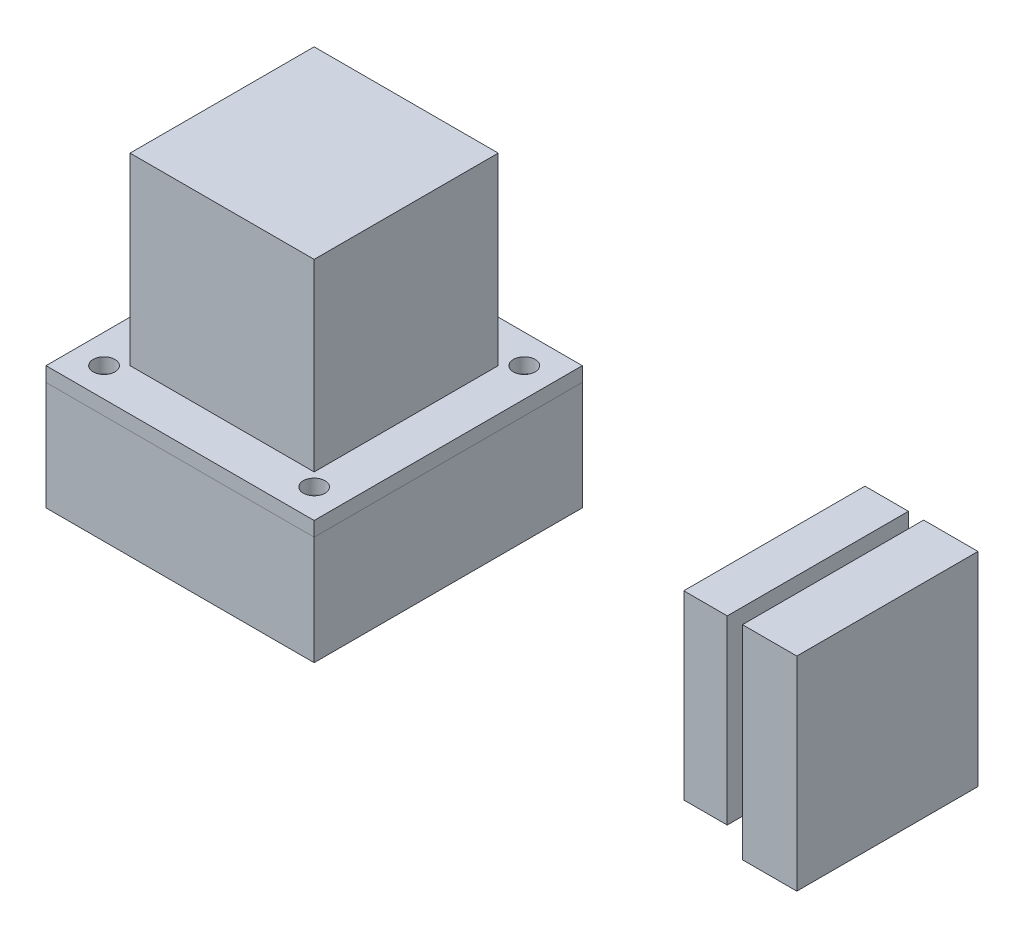
ISO-10303-21;
HEADER;
FILE_DESCRIPTION(('STEP AP214'),'2;1');
FILE_NAME('part.step','',(''),(''),'','','');
FILE_SCHEMA(('AUTOMOTIVE_DESIGN { 1 0 10303 214 1 1 1 1 }'));
ENDSEC;
DATA;
#1=APPLICATION_CONTEXT('core data for automotive mechanical design processes');
#2=APPLICATION_PROTOCOL_DEFINITION('international standard','automotive_design',2000,#1);
#3=PRODUCT_CONTEXT('',#1,'mechanical');
#4=PRODUCT('Part','Part','',(#3));
#5=PRODUCT_RELATED_PRODUCT_CATEGORY('part','',(#4));
#6=PRODUCT_DEFINITION_FORMATION('','',#4);
#7=PRODUCT_DEFINITION_CONTEXT('part definition',#1,'design');
#8=PRODUCT_DEFINITION('design','',#6,#7);
#9=PRODUCT_DEFINITION_SHAPE('','',#8);
#10=(LENGTH_UNIT() NAMED_UNIT(*) SI_UNIT(.MILLI.,.METRE.));
#11=(NAMED_UNIT(*) PLANE_ANGLE_UNIT() SI_UNIT($,.RADIAN.));
#12=(NAMED_UNIT(*) SI_UNIT($,.STERADIAN.) SOLID_ANGLE_UNIT());
#13=UNCERTAINTY_MEASURE_WITH_UNIT(LENGTH_MEASURE(1.E-05),#10,'distance_accuracy_value','');
#14=(GEOMETRIC_REPRESENTATION_CONTEXT(3) GLOBAL_UNCERTAINTY_ASSIGNED_CONTEXT((#13)) GLOBAL_UNIT_ASSIGNED_CONTEXT((#10,
#11,#12)) REPRESENTATION_CONTEXT('',''));
#15=CARTESIAN_POINT('',(0.,0.,0.));
#16=DIRECTION('',(0.,0.,1.));
#17=DIRECTION('',(1.,0.,0.));
#18=AXIS2_PLACEMENT_3D('',#15,#16,#17);
#19=CARTESIAN_POINT('',(-50.8,26.8,12.7));
#20=DIRECTION('',(-1.,0.,0.));
#21=DIRECTION('',(0.,0.,1.));
#22=AXIS2_PLACEMENT_3D('',#19,#20,#21);
#23=PLANE('',#22);
#24=DIRECTION('',(0.,0.,-1.));
#25=VECTOR('',#24,1.);
#26=CARTESIAN_POINT('',(-50.8,1.4,12.7));
#27=LINE('',#26,#25);
#28=CARTESIAN_POINT('',(-50.8,1.4,12.7));
#29=VERTEX_POINT('',#28);
#30=CARTESIAN_POINT('',(-50.8,1.4,-12.7));
#31=VERTEX_POINT('',#30);
#32=EDGE_CURVE('E108',#29,#31,#27,.T.);
#33=ORIENTED_EDGE('',*,*,#32,.T.);
#34=DIRECTION('',(0.,-1.,0.));
#35=VECTOR('',#34,1.);
#36=CARTESIAN_POINT('',(-50.8,26.8,-12.7));
#37=LINE('',#36,#35);
#38=CARTESIAN_POINT('',(-50.8,26.8,-12.7));
#39=VERTEX_POINT('',#38);
#40=EDGE_CURVE('E12',#39,#31,#37,.T.);
#41=ORIENTED_EDGE('',*,*,#40,.F.);
#42=DIRECTION('',(0.,0.,-1.));
#43=VECTOR('',#42,1.);
#44=CARTESIAN_POINT('',(-50.8,26.8,12.7));
#45=LINE('',#44,#43);
#46=CARTESIAN_POINT('',(-50.8,26.8,12.7));
#47=VERTEX_POINT('',#46);
#48=EDGE_CURVE('E96',#47,#39,#45,.T.);
#49=ORIENTED_EDGE('',*,*,#48,.F.);
#50=DIRECTION('',(0.,-1.,0.));
#51=VECTOR('',#50,1.);
#52=CARTESIAN_POINT('',(-50.8,26.8,12.7));
#53=LINE('',#52,#51);
#54=EDGE_CURVE('E104',#47,#29,#53,.T.);
#55=ORIENTED_EDGE('',*,*,#54,.T.);
#56=EDGE_LOOP('',(#33,#41,#49,#55));
#57=FACE_BOUND('',#56,.T.);
#58=ADVANCED_FACE('F45',(#57),#23,.F.);
#59=CARTESIAN_POINT('',(-76.2,26.8,-12.7));
#60=DIRECTION('',(0.,0.,1.));
#61=DIRECTION('',(0.,-1.,0.));
#62=AXIS2_PLACEMENT_3D('',#59,#60,#61);
#63=PLANE('',#62);
#64=DIRECTION('',(-1.,0.,0.));
#65=VECTOR('',#64,1.);
#66=CARTESIAN_POINT('',(-76.2,1.4,-12.7));
#67=LINE('',#66,#65);
#68=CARTESIAN_POINT('',(-76.2,1.4,-12.7));
#69=VERTEX_POINT('',#68);
#70=EDGE_CURVE('E100',#31,#69,#67,.T.);
#71=ORIENTED_EDGE('',*,*,#70,.T.);
#72=DIRECTION('',(0.,-1.,0.));
#73=VECTOR('',#72,1.);
#74=CARTESIAN_POINT('',(-76.2,26.8,-12.7));
#75=LINE('',#74,#73);
#76=CARTESIAN_POINT('',(-76.2,26.8,-12.7));
#77=VERTEX_POINT('',#76);
#78=EDGE_CURVE('E53',#77,#69,#75,.T.);
#79=ORIENTED_EDGE('',*,*,#78,.F.);
#80=DIRECTION('',(-1.,0.,0.));
#81=VECTOR('',#80,1.);
#82=CARTESIAN_POINT('',(-76.2,26.8,-12.7));
#83=LINE('',#82,#81);
#84=EDGE_CURVE('E91',#39,#77,#83,.T.);
#85=ORIENTED_EDGE('',*,*,#84,.F.);
#86=ORIENTED_EDGE('',*,*,#40,.T.);
#87=EDGE_LOOP('',(#71,#79,#85,#86));
#88=FACE_BOUND('',#87,.T.);
#89=ADVANCED_FACE('F99',(#88),#63,.F.);
#90=CARTESIAN_POINT('',(-76.2,26.8,12.7));
#91=DIRECTION('',(1.,0.,0.));
#92=DIRECTION('',(0.,0.,-1.));
#93=AXIS2_PLACEMENT_3D('',#90,#91,#92);
#94=PLANE('',#93);
#95=DIRECTION('',(0.,0.,1.));
#96=VECTOR('',#95,1.);
#97=CARTESIAN_POINT('',(-76.2,1.4,12.7));
#98=LINE('',#97,#96);
#99=CARTESIAN_POINT('',(-76.2,1.4,12.7));
#100=VERTEX_POINT('',#99);
#101=EDGE_CURVE('E78',#69,#100,#98,.T.);
#102=ORIENTED_EDGE('',*,*,#101,.T.);
#103=DIRECTION('',(0.,-1.,0.));
#104=VECTOR('',#103,1.);
#105=CARTESIAN_POINT('',(-76.2,26.8,12.7));
#106=LINE('',#105,#104);
#107=CARTESIAN_POINT('',(-76.2,26.8,12.7));
#108=VERTEX_POINT('',#107);
#109=EDGE_CURVE('E101',#108,#100,#106,.T.);
#110=ORIENTED_EDGE('',*,*,#109,.F.);
#111=DIRECTION('',(0.,0.,1.));
#112=VECTOR('',#111,1.);
#113=CARTESIAN_POINT('',(-76.2,26.8,12.7));
#114=LINE('',#113,#112);
#115=EDGE_CURVE('E94',#77,#108,#114,.T.);
#116=ORIENTED_EDGE('',*,*,#115,.F.);
#117=ORIENTED_EDGE('',*,*,#78,.T.);
#118=EDGE_LOOP('',(#102,#110,#116,#117));
#119=FACE_BOUND('',#118,.T.);
#120=ADVANCED_FACE('F102',(#119),#94,.F.);
#121=CARTESIAN_POINT('',(-76.2,26.8,12.7));
#122=DIRECTION('',(0.,0.,-1.));
#123=DIRECTION('',(0.,1.,0.));
#124=AXIS2_PLACEMENT_3D('',#121,#122,#123);
#125=PLANE('',#124);
#126=DIRECTION('',(1.,0.,0.));
#127=VECTOR('',#126,1.);
#128=CARTESIAN_POINT('',(-76.2,1.4,12.7));
#129=LINE('',#128,#127);
#130=EDGE_CURVE('E84',#100,#29,#129,.T.);
#131=ORIENTED_EDGE('',*,*,#130,.T.);
#132=ORIENTED_EDGE('',*,*,#54,.F.);
#133=DIRECTION('',(1.,0.,0.));
#134=VECTOR('',#133,1.);
#135=CARTESIAN_POINT('',(-76.2,26.8,12.7));
#136=LINE('',#135,#134);
#137=EDGE_CURVE('E61',#108,#47,#136,.T.);
#138=ORIENTED_EDGE('',*,*,#137,.F.);
#139=ORIENTED_EDGE('',*,*,#109,.T.);
#140=EDGE_LOOP('',(#131,#132,#138,#139));
#141=FACE_BOUND('',#140,.T.);
#142=ADVANCED_FACE('F115',(#141),#125,.F.);
#143=CARTESIAN_POINT('',(0.,26.8,0.));
#144=DIRECTION('',(0.,-1.,0.));
#145=DIRECTION('',(0.,0.,-1.));
#146=AXIS2_PLACEMENT_3D('',#143,#144,#145);
#147=PLANE('',#146);
#148=ORIENTED_EDGE('',*,*,#48,.T.);
#149=ORIENTED_EDGE('',*,*,#84,.T.);
#150=ORIENTED_EDGE('',*,*,#115,.T.);
#151=ORIENTED_EDGE('',*,*,#137,.T.);
#152=EDGE_LOOP('',(#148,#149,#150,#151));
#153=FACE_BOUND('',#152,.T.);
#154=ADVANCED_FACE('F92',(#153),#147,.F.);
#155=CARTESIAN_POINT('',(0.,1.4,0.));
#156=DIRECTION('',(0.,-1.,0.));
#157=DIRECTION('',(0.,0.,-1.));
#158=AXIS2_PLACEMENT_3D('',#155,#156,#157);
#159=PLANE('',#158);
#160=ORIENTED_EDGE('',*,*,#32,.F.);
#161=ORIENTED_EDGE('',*,*,#130,.F.);
#162=ORIENTED_EDGE('',*,*,#101,.F.);
#163=ORIENTED_EDGE('',*,*,#70,.F.);
#164=EDGE_LOOP('',(#160,#161,#162,#163));
#165=FACE_BOUND('',#164,.T.);
#166=ADVANCED_FACE('F118',(#165),#159,.T.);
#167=CLOSED_SHELL('',(#58,#89,#120,#142,#154,#166));
#168=MANIFOLD_SOLID_BREP('B2',#167);
#169=CARTESIAN_POINT('',(0.,1.4,0.));
#170=DIRECTION('',(0.,1.,0.));
#171=DIRECTION('',(0.,0.,1.));
#172=AXIS2_PLACEMENT_3D('',#169,#170,#171);
#173=PLANE('',#172);
#174=CARTESIAN_POINT('',(-49.0043109856754,1.4,-14.4956890143243));
#175=DIRECTION('',(0.,1.,0.));
#176=DIRECTION('',(0.,0.,1.));
#177=AXIS2_PLACEMENT_3D('',#174,#175,#176);
#178=CIRCLE('',#177,1.50000000000001);
#179=CARTESIAN_POINT('',(-49.0043109856754,1.4,-12.9956890143243));
#180=VERTEX_POINT('',#179);
#181=EDGE_CURVE('E266',#180,#180,#178,.T.);
#182=ORIENTED_EDGE('',*,*,#181,.F.);
#183=EDGE_LOOP('',(#182));
#184=FACE_BOUND('',#183,.T.);
#185=CARTESIAN_POINT('',(-77.9956890143241,1.4,14.495689014324));
#186=DIRECTION('',(0.,1.,0.));
#187=DIRECTION('',(0.,0.,1.));
#188=AXIS2_PLACEMENT_3D('',#185,#186,#187);
#189=CIRCLE('',#188,1.5);
#190=CARTESIAN_POINT('',(-77.9956890143241,1.4,15.995689014324));
#191=VERTEX_POINT('',#190);
#192=EDGE_CURVE('E245',#191,#191,#189,.T.);
#193=ORIENTED_EDGE('',*,*,#192,.F.);
#194=EDGE_LOOP('',(#193));
#195=FACE_BOUND('',#194,.T.);
#196=DIRECTION('',(0.,0.,1.));
#197=VECTOR('',#196,1.);
#198=CARTESIAN_POINT('',(-82.,1.4,-18.5));
#199=LINE('',#198,#197);
#200=CARTESIAN_POINT('',(-82.,1.4,-18.5));
#201=VERTEX_POINT('',#200);
#202=CARTESIAN_POINT('',(-82.,1.4,18.5));
#203=VERTEX_POINT('',#202);
#204=EDGE_CURVE('E230',#201,#203,#199,.T.);
#205=ORIENTED_EDGE('',*,*,#204,.T.);
#206=DIRECTION('',(1.,0.,0.));
#207=VECTOR('',#206,1.);
#208=CARTESIAN_POINT('',(-82.,1.4,18.5));
#209=LINE('',#208,#207);
#210=CARTESIAN_POINT('',(-45.,1.4,18.5));
#211=VERTEX_POINT('',#210);
#212=EDGE_CURVE('E225',#203,#211,#209,.T.);
#213=ORIENTED_EDGE('',*,*,#212,.T.);
#214=DIRECTION('',(0.,0.,-1.));
#215=VECTOR('',#214,1.);
#216=CARTESIAN_POINT('',(-45.,1.4,18.5));
#217=LINE('',#216,#215);
#218=CARTESIAN_POINT('',(-45.,1.4,-18.5));
#219=VERTEX_POINT('',#218);
#220=EDGE_CURVE('E228',#211,#219,#217,.T.);
#221=ORIENTED_EDGE('',*,*,#220,.T.);
#222=DIRECTION('',(-1.,0.,0.));
#223=VECTOR('',#222,1.);
#224=CARTESIAN_POINT('',(-45.,1.4,-18.5));
#225=LINE('',#224,#223);
#226=EDGE_CURVE('E195',#219,#201,#225,.T.);
#227=ORIENTED_EDGE('',*,*,#226,.T.);
#228=EDGE_LOOP('',(#205,#213,#221,#227));
#229=FACE_BOUND('',#228,.T.);
#230=CARTESIAN_POINT('',(-77.9956890143239,1.4,-14.4956890143245));
#231=DIRECTION('',(0.,1.,0.));
#232=DIRECTION('',(0.,0.,1.));
#233=AXIS2_PLACEMENT_3D('',#230,#231,#232);
#234=CIRCLE('',#233,1.5);
#235=CARTESIAN_POINT('',(-77.9956890143239,1.4,-12.9956890143245));
#236=VERTEX_POINT('',#235);
#237=EDGE_CURVE('E260',#236,#236,#234,.T.);
#238=ORIENTED_EDGE('',*,*,#237,.F.);
#239=EDGE_LOOP('',(#238));
#240=FACE_BOUND('',#239,.T.);
#241=CARTESIAN_POINT('',(-49.0043109856758,1.4,14.4956890143242));
#242=DIRECTION('',(0.,1.,0.));
#243=DIRECTION('',(0.,0.,1.));
#244=AXIS2_PLACEMENT_3D('',#241,#242,#243);
#245=CIRCLE('',#244,1.5);
#246=CARTESIAN_POINT('',(-49.0043109856758,1.4,15.9956890143242));
#247=VERTEX_POINT('',#246);
#248=EDGE_CURVE('E272',#247,#247,#245,.T.);
#249=ORIENTED_EDGE('',*,*,#248,.F.);
#250=EDGE_LOOP('',(#249));
#251=FACE_BOUND('',#250,.T.);
#252=ADVANCED_FACE('F178',(#184,#195,#229,#240,#251),#173,.T.);
#253=CARTESIAN_POINT('',(0.,-0.6,0.));
#254=DIRECTION('',(0.,1.,0.));
#255=DIRECTION('',(0.,0.,1.));
#256=AXIS2_PLACEMENT_3D('',#253,#254,#255);
#257=PLANE('',#256);
#258=CARTESIAN_POINT('',(-49.0043109856754,-0.600000000000001,-14.4956890143243));
#259=DIRECTION('',(0.,1.,0.));
#260=DIRECTION('',(0.,0.,1.));
#261=AXIS2_PLACEMENT_3D('',#258,#259,#260);
#262=CIRCLE('',#261,1.50000000000001);
#263=CARTESIAN_POINT('',(-49.0043109856754,-0.600000000000001,-12.9956890143243));
#264=VERTEX_POINT('',#263);
#265=EDGE_CURVE('E269',#264,#264,#262,.T.);
#266=ORIENTED_EDGE('',*,*,#265,.T.);
#267=EDGE_LOOP('',(#266));
#268=FACE_BOUND('',#267,.T.);
#269=CARTESIAN_POINT('',(-77.9956890143241,-0.599999999999998,14.495689014324));
#270=DIRECTION('',(0.,1.,0.));
#271=DIRECTION('',(0.,0.,1.));
#272=AXIS2_PLACEMENT_3D('',#269,#270,#271);
#273=CIRCLE('',#272,1.5);
#274=CARTESIAN_POINT('',(-77.9956890143241,-0.599999999999998,15.995689014324));
#275=VERTEX_POINT('',#274);
#276=EDGE_CURVE('E257',#275,#275,#273,.T.);
#277=ORIENTED_EDGE('',*,*,#276,.T.);
#278=EDGE_LOOP('',(#277));
#279=FACE_BOUND('',#278,.T.);
#280=DIRECTION('',(0.,0.,1.));
#281=VECTOR('',#280,1.);
#282=CARTESIAN_POINT('',(-82.,-0.600000000000002,-18.5));
#283=LINE('',#282,#281);
#284=CARTESIAN_POINT('',(-82.,-0.600000000000002,-18.5));
#285=VERTEX_POINT('',#284);
#286=CARTESIAN_POINT('',(-82.,-0.599999999999998,18.5));
#287=VERTEX_POINT('',#286);
#288=EDGE_CURVE('E242',#285,#287,#283,.T.);
#289=ORIENTED_EDGE('',*,*,#288,.F.);
#290=DIRECTION('',(-1.,0.,0.));
#291=VECTOR('',#290,1.);
#292=CARTESIAN_POINT('',(-45.,-0.600000000000002,-18.5));
#293=LINE('',#292,#291);
#294=CARTESIAN_POINT('',(-45.,-0.600000000000002,-18.5));
#295=VERTEX_POINT('',#294);
#296=EDGE_CURVE('E218',#295,#285,#293,.T.);
#297=ORIENTED_EDGE('',*,*,#296,.F.);
#298=DIRECTION('',(0.,0.,-1.));
#299=VECTOR('',#298,1.);
#300=CARTESIAN_POINT('',(-45.,-0.599999999999998,18.5));
#301=LINE('',#300,#299);
#302=CARTESIAN_POINT('',(-45.,-0.599999999999998,18.5));
#303=VERTEX_POINT('',#302);
#304=EDGE_CURVE('E212',#303,#295,#301,.T.);
#305=ORIENTED_EDGE('',*,*,#304,.F.);
#306=DIRECTION('',(1.,0.,0.));
#307=VECTOR('',#306,1.);
#308=CARTESIAN_POINT('',(-82.,-0.599999999999998,18.5));
#309=LINE('',#308,#307);
#310=EDGE_CURVE('E234',#287,#303,#309,.T.);
#311=ORIENTED_EDGE('',*,*,#310,.F.);
#312=EDGE_LOOP('',(#289,#297,#305,#311));
#313=FACE_BOUND('',#312,.T.);
#314=CARTESIAN_POINT('',(-77.9956890143239,-0.600000000000001,-14.4956890143245));
#315=DIRECTION('',(0.,1.,0.));
#316=DIRECTION('',(0.,0.,1.));
#317=AXIS2_PLACEMENT_3D('',#314,#315,#316);
#318=CIRCLE('',#317,1.5);
#319=CARTESIAN_POINT('',(-77.9956890143239,-0.600000000000001,-12.9956890143245));
#320=VERTEX_POINT('',#319);
#321=EDGE_CURVE('E263',#320,#320,#318,.T.);
#322=ORIENTED_EDGE('',*,*,#321,.T.);
#323=EDGE_LOOP('',(#322));
#324=FACE_BOUND('',#323,.T.);
#325=CARTESIAN_POINT('',(-49.0043109856758,-0.599999999999998,14.4956890143242));
#326=DIRECTION('',(0.,1.,0.));
#327=DIRECTION('',(0.,0.,1.));
#328=AXIS2_PLACEMENT_3D('',#325,#326,#327);
#329=CIRCLE('',#328,1.5);
#330=CARTESIAN_POINT('',(-49.0043109856758,-0.599999999999998,15.9956890143242));
#331=VERTEX_POINT('',#330);
#332=EDGE_CURVE('E275',#331,#331,#329,.T.);
#333=ORIENTED_EDGE('',*,*,#332,.T.);
#334=EDGE_LOOP('',(#333));
#335=FACE_BOUND('',#334,.T.);
#336=ADVANCED_FACE('F253',(#268,#279,#313,#324,#335),#257,.F.);
#337=CARTESIAN_POINT('',(-82.,1.4,-18.5));
#338=DIRECTION('',(1.,0.,0.));
#339=DIRECTION('',(0.,0.,-1.));
#340=AXIS2_PLACEMENT_3D('',#337,#338,#339);
#341=PLANE('',#340);
#342=ORIENTED_EDGE('',*,*,#288,.T.);
#343=DIRECTION('',(0.,-1.,0.));
#344=VECTOR('',#343,1.);
#345=CARTESIAN_POINT('',(-82.,1.4,18.5));
#346=LINE('',#345,#344);
#347=EDGE_CURVE('E43',#203,#287,#346,.T.);
#348=ORIENTED_EDGE('',*,*,#347,.F.);
#349=ORIENTED_EDGE('',*,*,#204,.F.);
#350=DIRECTION('',(0.,-1.,0.));
#351=VECTOR('',#350,1.);
#352=CARTESIAN_POINT('',(-82.,1.4,-18.5));
#353=LINE('',#352,#351);
#354=EDGE_CURVE('E238',#201,#285,#353,.T.);
#355=ORIENTED_EDGE('',*,*,#354,.T.);
#356=EDGE_LOOP('',(#342,#348,#349,#355));
#357=FACE_BOUND('',#356,.T.);
#358=ADVANCED_FACE('F180',(#357),#341,.F.);
#359=CARTESIAN_POINT('',(-82.,1.4,18.5));
#360=DIRECTION('',(0.,0.,-1.));
#361=DIRECTION('',(0.,1.,0.));
#362=AXIS2_PLACEMENT_3D('',#359,#360,#361);
#363=PLANE('',#362);
#364=ORIENTED_EDGE('',*,*,#310,.T.);
#365=DIRECTION('',(0.,-1.,0.));
#366=VECTOR('',#365,1.);
#367=CARTESIAN_POINT('',(-45.,1.4,18.5));
#368=LINE('',#367,#366);
#369=EDGE_CURVE('E187',#211,#303,#368,.T.);
#370=ORIENTED_EDGE('',*,*,#369,.F.);
#371=ORIENTED_EDGE('',*,*,#212,.F.);
#372=ORIENTED_EDGE('',*,*,#347,.T.);
#373=EDGE_LOOP('',(#364,#370,#371,#372));
#374=FACE_BOUND('',#373,.T.);
#375=ADVANCED_FACE('F233',(#374),#363,.F.);
#376=CARTESIAN_POINT('',(-45.,1.4,18.5));
#377=DIRECTION('',(-1.,0.,0.));
#378=DIRECTION('',(0.,0.,1.));
#379=AXIS2_PLACEMENT_3D('',#376,#377,#378);
#380=PLANE('',#379);
#381=ORIENTED_EDGE('',*,*,#304,.T.);
#382=DIRECTION('',(0.,-1.,0.));
#383=VECTOR('',#382,1.);
#384=CARTESIAN_POINT('',(-45.,1.4,-18.5));
#385=LINE('',#384,#383);
#386=EDGE_CURVE('E235',#219,#295,#385,.T.);
#387=ORIENTED_EDGE('',*,*,#386,.F.);
#388=ORIENTED_EDGE('',*,*,#220,.F.);
#389=ORIENTED_EDGE('',*,*,#369,.T.);
#390=EDGE_LOOP('',(#381,#387,#388,#389));
#391=FACE_BOUND('',#390,.T.);
#392=ADVANCED_FACE('F236',(#391),#380,.F.);
#393=CARTESIAN_POINT('',(-45.,1.4,-18.5));
#394=DIRECTION('',(0.,0.,1.));
#395=DIRECTION('',(0.,-1.,0.));
#396=AXIS2_PLACEMENT_3D('',#393,#394,#395);
#397=PLANE('',#396);
#398=ORIENTED_EDGE('',*,*,#296,.T.);
#399=ORIENTED_EDGE('',*,*,#354,.F.);
#400=ORIENTED_EDGE('',*,*,#226,.F.);
#401=ORIENTED_EDGE('',*,*,#386,.T.);
#402=EDGE_LOOP('',(#398,#399,#400,#401));
#403=FACE_BOUND('',#402,.T.);
#404=ADVANCED_FACE('F250',(#403),#397,.F.);
#405=CARTESIAN_POINT('',(-77.9956890143241,1.4,14.495689014324));
#406=DIRECTION('',(0.,-1.,0.));
#407=DIRECTION('',(0.,0.,-1.));
#408=AXIS2_PLACEMENT_3D('',#405,#406,#407);
#409=CYLINDRICAL_SURFACE('',#408,1.5);
#410=ORIENTED_EDGE('',*,*,#192,.T.);
#411=EDGE_LOOP('',(#410));
#412=FACE_BOUND('',#411,.T.);
#413=ORIENTED_EDGE('',*,*,#276,.F.);
#414=EDGE_LOOP('',(#413));
#415=FACE_BOUND('',#414,.T.);
#416=ADVANCED_FACE('F295',(#412,#415),#409,.F.);
#417=CARTESIAN_POINT('',(-77.9956890143239,1.4,-14.4956890143245));
#418=DIRECTION('',(0.,-1.,0.));
#419=DIRECTION('',(0.,0.,-1.));
#420=AXIS2_PLACEMENT_3D('',#417,#418,#419);
#421=CYLINDRICAL_SURFACE('',#420,1.5);
#422=ORIENTED_EDGE('',*,*,#237,.T.);
#423=EDGE_LOOP('',(#422));
#424=FACE_BOUND('',#423,.T.);
#425=ORIENTED_EDGE('',*,*,#321,.F.);
#426=EDGE_LOOP('',(#425));
#427=FACE_BOUND('',#426,.T.);
#428=ADVANCED_FACE('F341',(#424,#427),#421,.F.);
#429=CARTESIAN_POINT('',(-49.0043109856754,1.4,-14.4956890143243));
#430=DIRECTION('',(0.,-1.,0.));
#431=DIRECTION('',(0.,0.,-1.));
#432=AXIS2_PLACEMENT_3D('',#429,#430,#431);
#433=CYLINDRICAL_SURFACE('',#432,1.50000000000001);
#434=ORIENTED_EDGE('',*,*,#181,.T.);
#435=EDGE_LOOP('',(#434));
#436=FACE_BOUND('',#435,.T.);
#437=ORIENTED_EDGE('',*,*,#265,.F.);
#438=EDGE_LOOP('',(#437));
#439=FACE_BOUND('',#438,.T.);
#440=ADVANCED_FACE('F349',(#436,#439),#433,.F.);
#441=CARTESIAN_POINT('',(-49.0043109856758,1.4,14.4956890143242));
#442=DIRECTION('',(0.,-1.,0.));
#443=DIRECTION('',(0.,0.,-1.));
#444=AXIS2_PLACEMENT_3D('',#441,#442,#443);
#445=CYLINDRICAL_SURFACE('',#444,1.5);
#446=ORIENTED_EDGE('',*,*,#248,.T.);
#447=EDGE_LOOP('',(#446));
#448=FACE_BOUND('',#447,.T.);
#449=ORIENTED_EDGE('',*,*,#332,.F.);
#450=EDGE_LOOP('',(#449));
#451=FACE_BOUND('',#450,.T.);
#452=ADVANCED_FACE('F281',(#448,#451),#445,.F.);
#453=CLOSED_SHELL('',(#252,#336,#358,#375,#392,#404,#416,#428,#440,#452));
#454=MANIFOLD_SOLID_BREP('B6',#453);
#455=CARTESIAN_POINT('',(-45.,-0.600000000000002,-18.5));
#456=DIRECTION('',(1.,0.,0.));
#457=DIRECTION('',(0.,0.,-1.));
#458=AXIS2_PLACEMENT_3D('',#455,#456,#457);
#459=PLANE('',#458);
#460=DIRECTION('',(0.,0.,1.));
#461=VECTOR('',#460,1.);
#462=CARTESIAN_POINT('',(-45.,-15.6,-18.5));
#463=LINE('',#462,#461);
#464=CARTESIAN_POINT('',(-45.,-15.6,-18.5));
#465=VERTEX_POINT('',#464);
#466=CARTESIAN_POINT('',(-45.,-15.6,18.5));
#467=VERTEX_POINT('',#466);
#468=EDGE_CURVE('E460',#465,#467,#463,.T.);
#469=ORIENTED_EDGE('',*,*,#468,.F.);
#470=DIRECTION('',(0.,-1.,0.));
#471=VECTOR('',#470,1.);
#472=CARTESIAN_POINT('',(-45.,-0.600000000000002,-18.5));
#473=LINE('',#472,#471);
#474=CARTESIAN_POINT('',(-45.,-0.600000000000002,-18.5));
#475=VERTEX_POINT('',#474);
#476=EDGE_CURVE('E176',#475,#465,#473,.T.);
#477=ORIENTED_EDGE('',*,*,#476,.F.);
#478=DIRECTION('',(0.,0.,1.));
#479=VECTOR('',#478,1.);
#480=CARTESIAN_POINT('',(-45.,-0.600000000000002,-18.5));
#481=LINE('',#480,#479);
#482=CARTESIAN_POINT('',(-45.,-0.599999999999998,18.5));
#483=VERTEX_POINT('',#482);
#484=EDGE_CURVE('E453',#475,#483,#481,.T.);
#485=ORIENTED_EDGE('',*,*,#484,.T.);
#486=DIRECTION('',(0.,-1.,0.));
#487=VECTOR('',#486,1.);
#488=CARTESIAN_POINT('',(-45.,-0.599999999999998,18.5));
#489=LINE('',#488,#487);
#490=EDGE_CURVE('E398',#483,#467,#489,.T.);
#491=ORIENTED_EDGE('',*,*,#490,.T.);
#492=EDGE_LOOP('',(#469,#477,#485,#491));
#493=FACE_BOUND('',#492,.T.);
#494=ADVANCED_FACE('F395',(#493),#459,.T.);
#495=CARTESIAN_POINT('',(-82.,-0.600000000000002,-18.5));
#496=DIRECTION('',(0.,0.,-1.));
#497=DIRECTION('',(0.,1.,0.));
#498=AXIS2_PLACEMENT_3D('',#495,#496,#497);
#499=PLANE('',#498);
#500=DIRECTION('',(1.,0.,0.));
#501=VECTOR('',#500,1.);
#502=CARTESIAN_POINT('',(-82.,-15.6,-18.5));
#503=LINE('',#502,#501);
#504=CARTESIAN_POINT('',(-82.,-15.6,-18.5));
#505=VERTEX_POINT('',#504);
#506=EDGE_CURVE('E455',#505,#465,#503,.T.);
#507=ORIENTED_EDGE('',*,*,#506,.F.);
#508=DIRECTION('',(0.,-1.,0.));
#509=VECTOR('',#508,1.);
#510=CARTESIAN_POINT('',(-82.,-0.600000000000002,-18.5));
#511=LINE('',#510,#509);
#512=CARTESIAN_POINT('',(-82.,-0.600000000000002,-18.5));
#513=VERTEX_POINT('',#512);
#514=EDGE_CURVE('E404',#513,#505,#511,.T.);
#515=ORIENTED_EDGE('',*,*,#514,.F.);
#516=DIRECTION('',(1.,0.,0.));
#517=VECTOR('',#516,1.);
#518=CARTESIAN_POINT('',(-82.,-0.600000000000002,-18.5));
#519=LINE('',#518,#517);
#520=EDGE_CURVE('E450',#513,#475,#519,.T.);
#521=ORIENTED_EDGE('',*,*,#520,.T.);
#522=ORIENTED_EDGE('',*,*,#476,.T.);
#523=EDGE_LOOP('',(#507,#515,#521,#522));
#524=FACE_BOUND('',#523,.T.);
#525=ADVANCED_FACE('F471',(#524),#499,.T.);
#526=CARTESIAN_POINT('',(-82.,-0.600000000000002,-18.5));
#527=DIRECTION('',(-1.,0.,0.));
#528=DIRECTION('',(0.,0.,1.));
#529=AXIS2_PLACEMENT_3D('',#526,#527,#528);
#530=PLANE('',#529);
#531=DIRECTION('',(0.,0.,-1.));
#532=VECTOR('',#531,1.);
#533=CARTESIAN_POINT('',(-82.,-15.6,-18.5));
#534=LINE('',#533,#532);
#535=CARTESIAN_POINT('',(-82.,-15.6,18.5));
#536=VERTEX_POINT('',#535);
#537=EDGE_CURVE('E445',#536,#505,#534,.T.);
#538=ORIENTED_EDGE('',*,*,#537,.F.);
#539=DIRECTION('',(0.,-1.,0.));
#540=VECTOR('',#539,1.);
#541=CARTESIAN_POINT('',(-82.,-0.599999999999998,18.5));
#542=LINE('',#541,#540);
#543=CARTESIAN_POINT('',(-82.,-0.599999999999998,18.5));
#544=VERTEX_POINT('',#543);
#545=EDGE_CURVE('E440',#544,#536,#542,.T.);
#546=ORIENTED_EDGE('',*,*,#545,.F.);
#547=DIRECTION('',(0.,0.,-1.));
#548=VECTOR('',#547,1.);
#549=CARTESIAN_POINT('',(-82.,-0.600000000000002,-18.5));
#550=LINE('',#549,#548);
#551=EDGE_CURVE('E443',#544,#513,#550,.T.);
#552=ORIENTED_EDGE('',*,*,#551,.T.);
#553=ORIENTED_EDGE('',*,*,#514,.T.);
#554=EDGE_LOOP('',(#538,#546,#552,#553));
#555=FACE_BOUND('',#554,.T.);
#556=ADVANCED_FACE('F442',(#555),#530,.T.);
#557=CARTESIAN_POINT('',(-82.,-0.599999999999998,18.5));
#558=DIRECTION('',(0.,0.,1.));
#559=DIRECTION('',(0.,-1.,0.));
#560=AXIS2_PLACEMENT_3D('',#557,#558,#559);
#561=PLANE('',#560);
#562=DIRECTION('',(-1.,0.,0.));
#563=VECTOR('',#562,1.);
#564=CARTESIAN_POINT('',(-82.,-15.6,18.5));
#565=LINE('',#564,#563);
#566=EDGE_CURVE('E463',#467,#536,#565,.T.);
#567=ORIENTED_EDGE('',*,*,#566,.F.);
#568=ORIENTED_EDGE('',*,*,#490,.F.);
#569=DIRECTION('',(-1.,0.,0.));
#570=VECTOR('',#569,1.);
#571=CARTESIAN_POINT('',(-82.,-0.599999999999998,18.5));
#572=LINE('',#571,#570);
#573=EDGE_CURVE('E449',#483,#544,#572,.T.);
#574=ORIENTED_EDGE('',*,*,#573,.T.);
#575=ORIENTED_EDGE('',*,*,#545,.T.);
#576=EDGE_LOOP('',(#567,#568,#574,#575));
#577=FACE_BOUND('',#576,.T.);
#578=ADVANCED_FACE('F452',(#577),#561,.T.);
#579=CARTESIAN_POINT('',(0.,-0.6,0.));
#580=DIRECTION('',(0.,1.,0.));
#581=DIRECTION('',(0.,0.,1.));
#582=AXIS2_PLACEMENT_3D('',#579,#580,#581);
#583=PLANE('',#582);
#584=CARTESIAN_POINT('',(-77.9956890143241,-0.599999999999998,14.495689014324));
#585=DIRECTION('',(0.,-1.,0.));
#586=DIRECTION('',(0.,0.,-1.));
#587=AXIS2_PLACEMENT_3D('',#584,#585,#586);
#588=CIRCLE('',#587,1.5);
#589=CARTESIAN_POINT('',(-77.9956890143241,-0.599999999999998,12.995689014324));
#590=VERTEX_POINT('',#589);
#591=EDGE_CURVE('E512',#590,#590,#588,.T.);
#592=ORIENTED_EDGE('',*,*,#591,.T.);
#593=EDGE_LOOP('',(#592));
#594=FACE_BOUND('',#593,.T.);
#595=CARTESIAN_POINT('',(-77.9956890143239,-0.600000000000002,-14.4956890143245));
#596=DIRECTION('',(0.,-1.,0.));
#597=DIRECTION('',(0.,0.,-1.));
#598=AXIS2_PLACEMENT_3D('',#595,#596,#597);
#599=CIRCLE('',#598,1.5);
#600=CARTESIAN_POINT('',(-77.9956890143239,-0.600000000000002,-15.9956890143245));
#601=VERTEX_POINT('',#600);
#602=EDGE_CURVE('E520',#601,#601,#599,.T.);
#603=ORIENTED_EDGE('',*,*,#602,.T.);
#604=EDGE_LOOP('',(#603));
#605=FACE_BOUND('',#604,.T.);
#606=CARTESIAN_POINT('',(-49.0043109856754,-0.600000000000002,-14.4956890143243));
#607=DIRECTION('',(0.,-1.,0.));
#608=DIRECTION('',(0.,0.,-1.));
#609=AXIS2_PLACEMENT_3D('',#606,#607,#608);
#610=CIRCLE('',#609,1.50000000000001);
#611=CARTESIAN_POINT('',(-49.0043109856754,-0.600000000000002,-15.9956890143243));
#612=VERTEX_POINT('',#611);
#613=EDGE_CURVE('E526',#612,#612,#610,.T.);
#614=ORIENTED_EDGE('',*,*,#613,.T.);
#615=EDGE_LOOP('',(#614));
#616=FACE_BOUND('',#615,.T.);
#617=CARTESIAN_POINT('',(-49.0043109856758,-0.599999999999998,14.4956890143242));
#618=DIRECTION('',(0.,-1.,0.));
#619=DIRECTION('',(0.,0.,-1.));
#620=AXIS2_PLACEMENT_3D('',#617,#618,#619);
#621=CIRCLE('',#620,1.5);
#622=CARTESIAN_POINT('',(-49.0043109856758,-0.599999999999998,12.9956890143242));
#623=VERTEX_POINT('',#622);
#624=EDGE_CURVE('E464',#623,#623,#621,.T.);
#625=ORIENTED_EDGE('',*,*,#624,.T.);
#626=EDGE_LOOP('',(#625));
#627=FACE_BOUND('',#626,.T.);
#628=ORIENTED_EDGE('',*,*,#484,.F.);
#629=ORIENTED_EDGE('',*,*,#520,.F.);
#630=ORIENTED_EDGE('',*,*,#551,.F.);
#631=ORIENTED_EDGE('',*,*,#573,.F.);
#632=EDGE_LOOP('',(#628,#629,#630,#631));
#633=FACE_BOUND('',#632,.T.);
#634=ADVANCED_FACE('F448',(#594,#605,#616,#627,#633),#583,.T.);
#635=CARTESIAN_POINT('',(0.,-15.6,0.));
#636=DIRECTION('',(0.,1.,0.));
#637=DIRECTION('',(0.,0.,1.));
#638=AXIS2_PLACEMENT_3D('',#635,#636,#637);
#639=PLANE('',#638);
#640=CARTESIAN_POINT('',(-77.9956890143241,-15.6,14.495689014324));
#641=DIRECTION('',(0.,-1.,0.));
#642=DIRECTION('',(0.,0.,-1.));
#643=AXIS2_PLACEMENT_3D('',#640,#641,#642);
#644=CIRCLE('',#643,1.5);
#645=CARTESIAN_POINT('',(-77.9956890143241,-15.6,12.995689014324));
#646=VERTEX_POINT('',#645);
#647=EDGE_CURVE('E515',#646,#646,#644,.T.);
#648=ORIENTED_EDGE('',*,*,#647,.F.);
#649=EDGE_LOOP('',(#648));
#650=FACE_BOUND('',#649,.T.);
#651=CARTESIAN_POINT('',(-77.9956890143239,-15.6,-14.4956890143245));
#652=DIRECTION('',(0.,-1.,0.));
#653=DIRECTION('',(0.,0.,-1.));
#654=AXIS2_PLACEMENT_3D('',#651,#652,#653);
#655=CIRCLE('',#654,1.5);
#656=CARTESIAN_POINT('',(-77.9956890143239,-15.6,-15.9956890143245));
#657=VERTEX_POINT('',#656);
#658=EDGE_CURVE('E517',#657,#657,#655,.T.);
#659=ORIENTED_EDGE('',*,*,#658,.F.);
#660=EDGE_LOOP('',(#659));
#661=FACE_BOUND('',#660,.T.);
#662=CARTESIAN_POINT('',(-49.0043109856754,-15.6,-14.4956890143243));
#663=DIRECTION('',(0.,-1.,0.));
#664=DIRECTION('',(0.,0.,-1.));
#665=AXIS2_PLACEMENT_3D('',#662,#663,#664);
#666=CIRCLE('',#665,1.50000000000001);
#667=CARTESIAN_POINT('',(-49.0043109856754,-15.6,-15.9956890143243));
#668=VERTEX_POINT('',#667);
#669=EDGE_CURVE('E523',#668,#668,#666,.T.);
#670=ORIENTED_EDGE('',*,*,#669,.F.);
#671=EDGE_LOOP('',(#670));
#672=FACE_BOUND('',#671,.T.);
#673=CARTESIAN_POINT('',(-49.0043109856758,-15.6,14.4956890143242));
#674=DIRECTION('',(0.,-1.,0.));
#675=DIRECTION('',(0.,0.,-1.));
#676=AXIS2_PLACEMENT_3D('',#673,#674,#675);
#677=CIRCLE('',#676,1.5);
#678=CARTESIAN_POINT('',(-49.0043109856758,-15.6,12.9956890143242));
#679=VERTEX_POINT('',#678);
#680=EDGE_CURVE('E529',#679,#679,#677,.T.);
#681=ORIENTED_EDGE('',*,*,#680,.F.);
#682=EDGE_LOOP('',(#681));
#683=FACE_BOUND('',#682,.T.);
#684=ORIENTED_EDGE('',*,*,#468,.T.);
#685=ORIENTED_EDGE('',*,*,#566,.T.);
#686=ORIENTED_EDGE('',*,*,#537,.T.);
#687=ORIENTED_EDGE('',*,*,#506,.T.);
#688=EDGE_LOOP('',(#684,#685,#686,#687));
#689=FACE_BOUND('',#688,.T.);
#690=ADVANCED_FACE('F470',(#650,#661,#672,#683,#689),#639,.F.);
#691=CARTESIAN_POINT('',(-49.0043109856758,-0.599999999999998,14.4956890143242));
#692=DIRECTION('',(0.,-1.,0.));
#693=DIRECTION('',(0.,0.,-1.));
#694=AXIS2_PLACEMENT_3D('',#691,#692,#693);
#695=CYLINDRICAL_SURFACE('',#694,1.5);
#696=ORIENTED_EDGE('',*,*,#624,.F.);
#697=EDGE_LOOP('',(#696));
#698=FACE_BOUND('',#697,.T.);
#699=ORIENTED_EDGE('',*,*,#680,.T.);
#700=EDGE_LOOP('',(#699));
#701=FACE_BOUND('',#700,.T.);
#702=ADVANCED_FACE('F489',(#698,#701),#695,.F.);
#703=CARTESIAN_POINT('',(-49.0043109856754,-0.600000000000002,-14.4956890143243));
#704=DIRECTION('',(0.,-1.,0.));
#705=DIRECTION('',(0.,0.,-1.));
#706=AXIS2_PLACEMENT_3D('',#703,#704,#705);
#707=CYLINDRICAL_SURFACE('',#706,1.50000000000001);
#708=ORIENTED_EDGE('',*,*,#613,.F.);
#709=EDGE_LOOP('',(#708));
#710=FACE_BOUND('',#709,.T.);
#711=ORIENTED_EDGE('',*,*,#669,.T.);
#712=EDGE_LOOP('',(#711));
#713=FACE_BOUND('',#712,.T.);
#714=ADVANCED_FACE('F496',(#710,#713),#707,.F.);
#715=CARTESIAN_POINT('',(-77.9956890143239,-0.600000000000002,-14.4956890143245));
#716=DIRECTION('',(0.,-1.,0.));
#717=DIRECTION('',(0.,0.,-1.));
#718=AXIS2_PLACEMENT_3D('',#715,#716,#717);
#719=CYLINDRICAL_SURFACE('',#718,1.5);
#720=ORIENTED_EDGE('',*,*,#602,.F.);
#721=EDGE_LOOP('',(#720));
#722=FACE_BOUND('',#721,.T.);
#723=ORIENTED_EDGE('',*,*,#658,.T.);
#724=EDGE_LOOP('',(#723));
#725=FACE_BOUND('',#724,.T.);
#726=ADVANCED_FACE('F500',(#722,#725),#719,.F.);
#727=CARTESIAN_POINT('',(-77.9956890143241,-0.599999999999998,14.495689014324));
#728=DIRECTION('',(0.,-1.,0.));
#729=DIRECTION('',(0.,0.,-1.));
#730=AXIS2_PLACEMENT_3D('',#727,#728,#729);
#731=CYLINDRICAL_SURFACE('',#730,1.5);
#732=ORIENTED_EDGE('',*,*,#591,.F.);
#733=EDGE_LOOP('',(#732));
#734=FACE_BOUND('',#733,.T.);
#735=ORIENTED_EDGE('',*,*,#647,.T.);
#736=EDGE_LOOP('',(#735));
#737=FACE_BOUND('',#736,.T.);
#738=ADVANCED_FACE('F504',(#734,#737),#731,.F.);
#739=CLOSED_SHELL('',(#494,#525,#556,#578,#634,#690,#702,#714,#726,#738));
#740=MANIFOLD_SOLID_BREP('B37',#739);
#741=CARTESIAN_POINT('',(8.1,-15.6,-12.5));
#742=DIRECTION('',(0.,0.,1.));
#743=DIRECTION('',(1.,0.,0.));
#744=AXIS2_PLACEMENT_3D('',#741,#742,#743);
#745=PLANE('',#744);
#746=DIRECTION('',(0.,-1.,0.));
#747=VECTOR('',#746,1.);
#748=CARTESIAN_POINT('',(15.6,-15.6,-12.5));
#749=LINE('',#748,#747);
#750=CARTESIAN_POINT('',(15.6,12.5,-12.5));
#751=VERTEX_POINT('',#750);
#752=CARTESIAN_POINT('',(15.6,-15.6,-12.5));
#753=VERTEX_POINT('',#752);
#754=EDGE_CURVE('E674',#751,#753,#749,.T.);
#755=ORIENTED_EDGE('',*,*,#754,.T.);
#756=DIRECTION('',(1.,0.,0.));
#757=VECTOR('',#756,1.);
#758=CARTESIAN_POINT('',(8.1,-15.6,-12.5));
#759=LINE('',#758,#757);
#760=CARTESIAN_POINT('',(8.1,-15.6,-12.5));
#761=VERTEX_POINT('',#760);
#762=EDGE_CURVE('E393',#761,#753,#759,.T.);
#763=ORIENTED_EDGE('',*,*,#762,.F.);
#764=DIRECTION('',(0.,-1.,0.));
#765=VECTOR('',#764,1.);
#766=CARTESIAN_POINT('',(8.1,-15.6,-12.5));
#767=LINE('',#766,#765);
#768=CARTESIAN_POINT('',(8.1,12.5,-12.5));
#769=VERTEX_POINT('',#768);
#770=EDGE_CURVE('E662',#769,#761,#767,.T.);
#771=ORIENTED_EDGE('',*,*,#770,.F.);
#772=DIRECTION('',(1.,0.,0.));
#773=VECTOR('',#772,1.);
#774=CARTESIAN_POINT('',(8.1,12.5,-12.5));
#775=LINE('',#774,#773);
#776=EDGE_CURVE('E670',#769,#751,#775,.T.);
#777=ORIENTED_EDGE('',*,*,#776,.T.);
#778=EDGE_LOOP('',(#755,#763,#771,#777));
#779=FACE_BOUND('',#778,.T.);
#780=ADVANCED_FACE('F611',(#779),#745,.F.);
#781=CARTESIAN_POINT('',(8.1,-15.6,12.5));
#782=DIRECTION('',(0.,1.,0.));
#783=DIRECTION('',(0.,0.,1.));
#784=AXIS2_PLACEMENT_3D('',#781,#782,#783);
#785=PLANE('',#784);
#786=DIRECTION('',(0.,0.,1.));
#787=VECTOR('',#786,1.);
#788=CARTESIAN_POINT('',(15.6,-15.6,12.5));
#789=LINE('',#788,#787);
#790=CARTESIAN_POINT('',(15.6,-15.6,12.5));
#791=VERTEX_POINT('',#790);
#792=EDGE_CURVE('E666',#753,#791,#789,.T.);
#793=ORIENTED_EDGE('',*,*,#792,.T.);
#794=DIRECTION('',(1.,0.,0.));
#795=VECTOR('',#794,1.);
#796=CARTESIAN_POINT('',(8.1,-15.6,12.5));
#797=LINE('',#796,#795);
#798=CARTESIAN_POINT('',(8.1,-15.6,12.5));
#799=VERTEX_POINT('',#798);
#800=EDGE_CURVE('E619',#799,#791,#797,.T.);
#801=ORIENTED_EDGE('',*,*,#800,.F.);
#802=DIRECTION('',(0.,0.,1.));
#803=VECTOR('',#802,1.);
#804=CARTESIAN_POINT('',(8.1,-15.6,12.5));
#805=LINE('',#804,#803);
#806=EDGE_CURVE('E657',#761,#799,#805,.T.);
#807=ORIENTED_EDGE('',*,*,#806,.F.);
#808=ORIENTED_EDGE('',*,*,#762,.T.);
#809=EDGE_LOOP('',(#793,#801,#807,#808));
#810=FACE_BOUND('',#809,.T.);
#811=ADVANCED_FACE('F665',(#810),#785,.F.);
#812=CARTESIAN_POINT('',(8.1,12.5,12.5));
#813=DIRECTION('',(0.,0.,-1.));
#814=DIRECTION('',(0.,1.,0.));
#815=AXIS2_PLACEMENT_3D('',#812,#813,#814);
#816=PLANE('',#815);
#817=DIRECTION('',(0.,1.,0.));
#818=VECTOR('',#817,1.);
#819=CARTESIAN_POINT('',(15.6,12.5,12.5));
#820=LINE('',#819,#818);
#821=CARTESIAN_POINT('',(15.6,12.5,12.5));
#822=VERTEX_POINT('',#821);
#823=EDGE_CURVE('E644',#791,#822,#820,.T.);
#824=ORIENTED_EDGE('',*,*,#823,.T.);
#825=DIRECTION('',(1.,0.,0.));
#826=VECTOR('',#825,1.);
#827=CARTESIAN_POINT('',(8.1,12.5,12.5));
#828=LINE('',#827,#826);
#829=CARTESIAN_POINT('',(8.1,12.5,12.5));
#830=VERTEX_POINT('',#829);
#831=EDGE_CURVE('E667',#830,#822,#828,.T.);
#832=ORIENTED_EDGE('',*,*,#831,.F.);
#833=DIRECTION('',(0.,1.,0.));
#834=VECTOR('',#833,1.);
#835=CARTESIAN_POINT('',(8.1,12.5,12.5));
#836=LINE('',#835,#834);
#837=EDGE_CURVE('E660',#799,#830,#836,.T.);
#838=ORIENTED_EDGE('',*,*,#837,.F.);
#839=ORIENTED_EDGE('',*,*,#800,.T.);
#840=EDGE_LOOP('',(#824,#832,#838,#839));
#841=FACE_BOUND('',#840,.T.);
#842=ADVANCED_FACE('F668',(#841),#816,.F.);
#843=CARTESIAN_POINT('',(8.1,12.5,-12.5));
#844=DIRECTION('',(0.,-1.,0.));
#845=DIRECTION('',(0.,0.,-1.));
#846=AXIS2_PLACEMENT_3D('',#843,#844,#845);
#847=PLANE('',#846);
#848=DIRECTION('',(0.,0.,-1.));
#849=VECTOR('',#848,1.);
#850=CARTESIAN_POINT('',(15.6,12.5,-12.5));
#851=LINE('',#850,#849);
#852=EDGE_CURVE('E650',#822,#751,#851,.T.);
#853=ORIENTED_EDGE('',*,*,#852,.T.);
#854=ORIENTED_EDGE('',*,*,#776,.F.);
#855=DIRECTION('',(0.,0.,-1.));
#856=VECTOR('',#855,1.);
#857=CARTESIAN_POINT('',(8.1,12.5,-12.5));
#858=LINE('',#857,#856);
#859=EDGE_CURVE('E627',#830,#769,#858,.T.);
#860=ORIENTED_EDGE('',*,*,#859,.F.);
#861=ORIENTED_EDGE('',*,*,#831,.T.);
#862=EDGE_LOOP('',(#853,#854,#860,#861));
#863=FACE_BOUND('',#862,.T.);
#864=ADVANCED_FACE('F681',(#863),#847,.F.);
#865=CARTESIAN_POINT('',(8.1,0.,0.));
#866=DIRECTION('',(1.,0.,0.));
#867=DIRECTION('',(0.,0.,-1.));
#868=AXIS2_PLACEMENT_3D('',#865,#866,#867);
#869=PLANE('',#868);
#870=ORIENTED_EDGE('',*,*,#770,.T.);
#871=ORIENTED_EDGE('',*,*,#806,.T.);
#872=ORIENTED_EDGE('',*,*,#837,.T.);
#873=ORIENTED_EDGE('',*,*,#859,.T.);
#874=EDGE_LOOP('',(#870,#871,#872,#873));
#875=FACE_BOUND('',#874,.T.);
#876=ADVANCED_FACE('F658',(#875),#869,.F.);
#877=CARTESIAN_POINT('',(15.6,0.,0.));
#878=DIRECTION('',(1.,0.,0.));
#879=DIRECTION('',(0.,0.,-1.));
#880=AXIS2_PLACEMENT_3D('',#877,#878,#879);
#881=PLANE('',#880);
#882=ORIENTED_EDGE('',*,*,#754,.F.);
#883=ORIENTED_EDGE('',*,*,#852,.F.);
#884=ORIENTED_EDGE('',*,*,#823,.F.);
#885=ORIENTED_EDGE('',*,*,#792,.F.);
#886=EDGE_LOOP('',(#882,#883,#884,#885));
#887=FACE_BOUND('',#886,.T.);
#888=ADVANCED_FACE('F684',(#887),#881,.T.);
#889=CLOSED_SHELL('',(#780,#811,#842,#864,#876,#888));
#890=MANIFOLD_SOLID_BREP('B170_NOT_SHOWN',#889);
#891=CARTESIAN_POINT('',(6.,12.5,-12.5));
#892=DIRECTION('',(0.,0.,1.));
#893=DIRECTION('',(0.,-1.,0.));
#894=AXIS2_PLACEMENT_3D('',#891,#892,#893);
#895=PLANE('',#894);
#896=DIRECTION('',(0.,1.,0.));
#897=VECTOR('',#896,1.);
#898=CARTESIAN_POINT('',(0.,12.5,-12.5));
#899=LINE('',#898,#897);
#900=CARTESIAN_POINT('',(0.,-12.5,-12.5));
#901=VERTEX_POINT('',#900);
#902=CARTESIAN_POINT('',(0.,12.5,-12.5));
#903=VERTEX_POINT('',#902);
#904=EDGE_CURVE('E797',#901,#903,#899,.T.);
#905=ORIENTED_EDGE('',*,*,#904,.T.);
#906=DIRECTION('',(-1.,0.,0.));
#907=VECTOR('',#906,1.);
#908=CARTESIAN_POINT('',(6.,12.5,-12.5));
#909=LINE('',#908,#907);
#910=CARTESIAN_POINT('',(6.,12.5,-12.5));
#911=VERTEX_POINT('',#910);
#912=EDGE_CURVE('E609',#911,#903,#909,.T.);
#913=ORIENTED_EDGE('',*,*,#912,.F.);
#914=DIRECTION('',(0.,1.,0.));
#915=VECTOR('',#914,1.);
#916=CARTESIAN_POINT('',(6.,12.5,-12.5));
#917=LINE('',#916,#915);
#918=CARTESIAN_POINT('',(6.,-12.5,-12.5));
#919=VERTEX_POINT('',#918);
#920=EDGE_CURVE('E785',#919,#911,#917,.T.);
#921=ORIENTED_EDGE('',*,*,#920,.F.);
#922=DIRECTION('',(-1.,0.,0.));
#923=VECTOR('',#922,1.);
#924=CARTESIAN_POINT('',(6.,-12.5,-12.5));
#925=LINE('',#924,#923);
#926=EDGE_CURVE('E793',#919,#901,#925,.T.);
#927=ORIENTED_EDGE('',*,*,#926,.T.);
#928=EDGE_LOOP('',(#905,#913,#921,#927));
#929=FACE_BOUND('',#928,.T.);
#930=ADVANCED_FACE('F734',(#929),#895,.F.);
#931=CARTESIAN_POINT('',(6.,12.5,12.5));
#932=DIRECTION('',(0.,-1.,0.));
#933=DIRECTION('',(0.,0.,-1.));
#934=AXIS2_PLACEMENT_3D('',#931,#932,#933);
#935=PLANE('',#934);
#936=DIRECTION('',(0.,0.,1.));
#937=VECTOR('',#936,1.);
#938=CARTESIAN_POINT('',(0.,12.5,12.5));
#939=LINE('',#938,#937);
#940=CARTESIAN_POINT('',(0.,12.5,12.5));
#941=VERTEX_POINT('',#940);
#942=EDGE_CURVE('E789',#903,#941,#939,.T.);
#943=ORIENTED_EDGE('',*,*,#942,.T.);
#944=DIRECTION('',(-1.,0.,0.));
#945=VECTOR('',#944,1.);
#946=CARTESIAN_POINT('',(6.,12.5,12.5));
#947=LINE('',#946,#945);
#948=CARTESIAN_POINT('',(6.,12.5,12.5));
#949=VERTEX_POINT('',#948);
#950=EDGE_CURVE('E742',#949,#941,#947,.T.);
#951=ORIENTED_EDGE('',*,*,#950,.F.);
#952=DIRECTION('',(0.,0.,1.));
#953=VECTOR('',#952,1.);
#954=CARTESIAN_POINT('',(6.,12.5,12.5));
#955=LINE('',#954,#953);
#956=EDGE_CURVE('E780',#911,#949,#955,.T.);
#957=ORIENTED_EDGE('',*,*,#956,.F.);
#958=ORIENTED_EDGE('',*,*,#912,.T.);
#959=EDGE_LOOP('',(#943,#951,#957,#958));
#960=FACE_BOUND('',#959,.T.);
#961=ADVANCED_FACE('F788',(#960),#935,.F.);
#962=CARTESIAN_POINT('',(6.,12.5,12.5));
#963=DIRECTION('',(0.,0.,-1.));
#964=DIRECTION('',(0.,1.,0.));
#965=AXIS2_PLACEMENT_3D('',#962,#963,#964);
#966=PLANE('',#965);
#967=DIRECTION('',(0.,-1.,0.));
#968=VECTOR('',#967,1.);
#969=CARTESIAN_POINT('',(0.,12.5,12.5));
#970=LINE('',#969,#968);
#971=CARTESIAN_POINT('',(0.,-12.5,12.5));
#972=VERTEX_POINT('',#971);
#973=EDGE_CURVE('E767',#941,#972,#970,.T.);
#974=ORIENTED_EDGE('',*,*,#973,.T.);
#975=DIRECTION('',(-1.,0.,0.));
#976=VECTOR('',#975,1.);
#977=CARTESIAN_POINT('',(6.,-12.5,12.5));
#978=LINE('',#977,#976);
#979=CARTESIAN_POINT('',(6.,-12.5,12.5));
#980=VERTEX_POINT('',#979);
#981=EDGE_CURVE('E790',#980,#972,#978,.T.);
#982=ORIENTED_EDGE('',*,*,#981,.F.);
#983=DIRECTION('',(0.,-1.,0.));
#984=VECTOR('',#983,1.);
#985=CARTESIAN_POINT('',(6.,12.5,12.5));
#986=LINE('',#985,#984);
#987=EDGE_CURVE('E783',#949,#980,#986,.T.);
#988=ORIENTED_EDGE('',*,*,#987,.F.);
#989=ORIENTED_EDGE('',*,*,#950,.T.);
#990=EDGE_LOOP('',(#974,#982,#988,#989));
#991=FACE_BOUND('',#990,.T.);
#992=ADVANCED_FACE('F791',(#991),#966,.F.);
#993=CARTESIAN_POINT('',(6.,-12.5,12.5));
#994=DIRECTION('',(0.,1.,0.));
#995=DIRECTION('',(0.,0.,1.));
#996=AXIS2_PLACEMENT_3D('',#993,#994,#995);
#997=PLANE('',#996);
#998=DIRECTION('',(0.,0.,-1.));
#999=VECTOR('',#998,1.);
#1000=CARTESIAN_POINT('',(0.,-12.5,12.5));
#1001=LINE('',#1000,#999);
#1002=EDGE_CURVE('E773',#972,#901,#1001,.T.);
#1003=ORIENTED_EDGE('',*,*,#1002,.T.);
#1004=ORIENTED_EDGE('',*,*,#926,.F.);
#1005=DIRECTION('',(0.,0.,-1.));
#1006=VECTOR('',#1005,1.);
#1007=CARTESIAN_POINT('',(6.,-12.5,12.5));
#1008=LINE('',#1007,#1006);
#1009=EDGE_CURVE('E750',#980,#919,#1008,.T.);
#1010=ORIENTED_EDGE('',*,*,#1009,.F.);
#1011=ORIENTED_EDGE('',*,*,#981,.T.);
#1012=EDGE_LOOP('',(#1003,#1004,#1010,#1011));
#1013=FACE_BOUND('',#1012,.T.);
#1014=ADVANCED_FACE('F804',(#1013),#997,.F.);
#1015=CARTESIAN_POINT('',(6.,0.,0.));
#1016=DIRECTION('',(1.,0.,0.));
#1017=DIRECTION('',(0.,0.,-1.));
#1018=AXIS2_PLACEMENT_3D('',#1015,#1016,#1017);
#1019=PLANE('',#1018);
#1020=ORIENTED_EDGE('',*,*,#920,.T.);
#1021=ORIENTED_EDGE('',*,*,#956,.T.);
#1022=ORIENTED_EDGE('',*,*,#987,.T.);
#1023=ORIENTED_EDGE('',*,*,#1009,.T.);
#1024=EDGE_LOOP('',(#1020,#1021,#1022,#1023));
#1025=FACE_BOUND('',#1024,.T.);
#1026=ADVANCED_FACE('F781',(#1025),#1019,.T.);
#1027=CARTESIAN_POINT('',(0.,0.,0.));
#1028=DIRECTION('',(1.,0.,0.));
#1029=DIRECTION('',(0.,0.,-1.));
#1030=AXIS2_PLACEMENT_3D('',#1027,#1028,#1029);
#1031=PLANE('',#1030);
#1032=ORIENTED_EDGE('',*,*,#904,.F.);
#1033=ORIENTED_EDGE('',*,*,#1002,.F.);
#1034=ORIENTED_EDGE('',*,*,#973,.F.);
#1035=ORIENTED_EDGE('',*,*,#942,.F.);
#1036=EDGE_LOOP('',(#1032,#1033,#1034,#1035));
#1037=FACE_BOUND('',#1036,.T.);
#1038=ADVANCED_FACE('F807',(#1037),#1031,.F.);
#1039=CLOSED_SHELL('',(#930,#961,#992,#1014,#1026,#1038));
#1040=MANIFOLD_SOLID_BREP('B387_NOT_SHOWN',#1039);
#1041=ADVANCED_BREP_SHAPE_REPRESENTATION('',(#18,#168,#454,#740,#890,#1040),#14);
#1042=SHAPE_DEFINITION_REPRESENTATION(#9,#1041);
ENDSEC;
END-ISO-10303-21;
